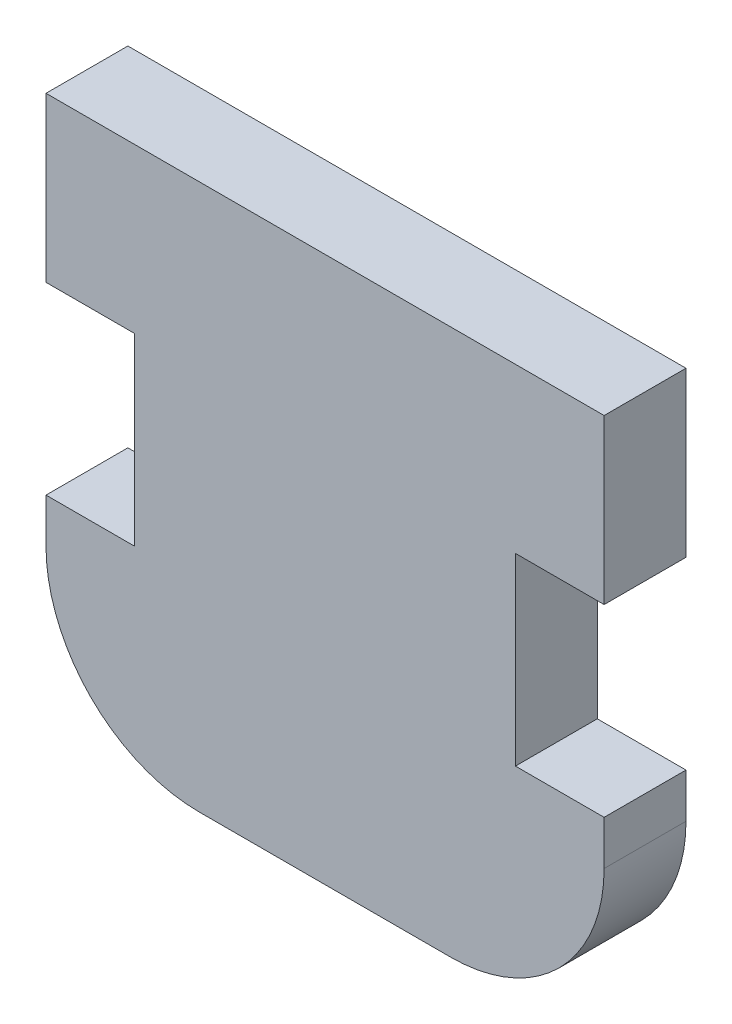
ISO-10303-21;
HEADER;
FILE_DESCRIPTION(('STEP AP214'),'2;1');
FILE_NAME('part.step','',(''),(''),'','','');
FILE_SCHEMA(('AUTOMOTIVE_DESIGN { 1 0 10303 214 1 1 1 1 }'));
ENDSEC;
DATA;
#1=APPLICATION_CONTEXT('core data for automotive mechanical design processes');
#2=APPLICATION_PROTOCOL_DEFINITION('international standard','automotive_design',2000,#1);
#3=PRODUCT_CONTEXT('',#1,'mechanical');
#4=PRODUCT('Part','Part','',(#3));
#5=PRODUCT_RELATED_PRODUCT_CATEGORY('part','',(#4));
#6=PRODUCT_DEFINITION_FORMATION('','',#4);
#7=PRODUCT_DEFINITION_CONTEXT('part definition',#1,'design');
#8=PRODUCT_DEFINITION('design','',#6,#7);
#9=PRODUCT_DEFINITION_SHAPE('','',#8);
#10=(LENGTH_UNIT() NAMED_UNIT(*) SI_UNIT(.MILLI.,.METRE.));
#11=(NAMED_UNIT(*) PLANE_ANGLE_UNIT() SI_UNIT($,.RADIAN.));
#12=(NAMED_UNIT(*) SI_UNIT($,.STERADIAN.) SOLID_ANGLE_UNIT());
#13=UNCERTAINTY_MEASURE_WITH_UNIT(LENGTH_MEASURE(1.E-05),#10,'distance_accuracy_value','');
#14=(GEOMETRIC_REPRESENTATION_CONTEXT(3) GLOBAL_UNCERTAINTY_ASSIGNED_CONTEXT((#13)) GLOBAL_UNIT_ASSIGNED_CONTEXT((#10,
#11,#12)) REPRESENTATION_CONTEXT('',''));
#15=CARTESIAN_POINT('',(0.,0.,0.));
#16=DIRECTION('',(0.,0.,1.));
#17=DIRECTION('',(1.,0.,0.));
#18=AXIS2_PLACEMENT_3D('',#15,#16,#17);
#19=CARTESIAN_POINT('',(-432.269899999999,-6.09600000000033,3.048));
#20=DIRECTION('',(0.,1.,0.));
#21=DIRECTION('',(-1.,0.,0.));
#22=AXIS2_PLACEMENT_3D('',#19,#20,#21);
#23=PLANE('',#22);
#24=DIRECTION('',(0.,0.,1.));
#25=VECTOR('',#24,1.);
#26=CARTESIAN_POINT('',(-435.825899999999,-6.09600000000033,3.048));
#27=LINE('',#26,#25);
#28=CARTESIAN_POINT('',(-435.825899999999,-6.09600000000033,0.));
#29=VERTEX_POINT('',#28);
#30=CARTESIAN_POINT('',(-435.825899999999,-6.09600000000033,3.048));
#31=VERTEX_POINT('',#30);
#32=EDGE_CURVE('E11',#29,#31,#27,.T.);
#33=ORIENTED_EDGE('',*,*,#32,.F.);
#34=DIRECTION('',(1.,0.,0.));
#35=VECTOR('',#34,1.);
#36=CARTESIAN_POINT('',(-438.238899999999,-6.09600000000033,0.));
#37=LINE('',#36,#35);
#38=CARTESIAN_POINT('',(-432.523899999999,-6.09600000000033,0.));
#39=VERTEX_POINT('',#38);
#40=EDGE_CURVE('E128',#39,#29,#37,.F.);
#41=ORIENTED_EDGE('',*,*,#40,.F.);
#42=DIRECTION('',(0.,0.,1.));
#43=VECTOR('',#42,1.);
#44=CARTESIAN_POINT('',(-432.523899999999,-6.09600000000033,3.048));
#45=LINE('',#44,#43);
#46=CARTESIAN_POINT('',(-432.523899999999,-6.09600000000033,3.048));
#47=VERTEX_POINT('',#46);
#48=EDGE_CURVE('E53',#39,#47,#45,.T.);
#49=ORIENTED_EDGE('',*,*,#48,.T.);
#50=DIRECTION('',(-1.,0.,0.));
#51=VECTOR('',#50,1.);
#52=CARTESIAN_POINT('',(-432.269899999999,-6.09600000000033,3.048));
#53=LINE('',#52,#51);
#54=EDGE_CURVE('E203',#47,#31,#53,.T.);
#55=ORIENTED_EDGE('',*,*,#54,.T.);
#56=EDGE_LOOP('',(#33,#41,#49,#55));
#57=FACE_BOUND('',#56,.T.);
#58=ADVANCED_FACE('F43',(#57),#23,.F.);
#59=CARTESIAN_POINT('',(-432.523899999999,-3.33066907387547E-13,3.048));
#60=DIRECTION('',(-1.,0.,0.));
#61=DIRECTION('',(0.,-1.,0.));
#62=AXIS2_PLACEMENT_3D('',#59,#60,#61);
#63=PLANE('',#62);
#64=ORIENTED_EDGE('',*,*,#48,.F.);
#65=DIRECTION('',(0.,1.,0.));
#66=VECTOR('',#65,1.);
#67=CARTESIAN_POINT('',(-432.523899999999,-14.6050000000003,0.));
#68=LINE('',#67,#66);
#69=CARTESIAN_POINT('',(-432.523899999999,-3.33066907387547E-13,0.));
#70=VERTEX_POINT('',#69);
#71=EDGE_CURVE('E166',#70,#39,#68,.F.);
#72=ORIENTED_EDGE('',*,*,#71,.F.);
#73=DIRECTION('',(0.,0.,1.));
#74=VECTOR('',#73,1.);
#75=CARTESIAN_POINT('',(-432.523899999999,-3.33066907387547E-13,3.048));
#76=LINE('',#75,#74);
#77=CARTESIAN_POINT('',(-432.523899999999,-3.33066907387547E-13,3.048));
#78=VERTEX_POINT('',#77);
#79=EDGE_CURVE('E196',#70,#78,#76,.T.);
#80=ORIENTED_EDGE('',*,*,#79,.T.);
#81=DIRECTION('',(0.,-1.,0.));
#82=VECTOR('',#81,1.);
#83=CARTESIAN_POINT('',(-432.523899999999,-3.33066907387547E-13,3.048));
#84=LINE('',#83,#82);
#85=EDGE_CURVE('E213',#78,#47,#84,.T.);
#86=ORIENTED_EDGE('',*,*,#85,.T.);
#87=EDGE_LOOP('',(#64,#72,#80,#86));
#88=FACE_BOUND('',#87,.T.);
#89=ADVANCED_FACE('F216',(#88),#63,.F.);
#90=CARTESIAN_POINT('',(-450.253099999998,-3.33066907387547E-13,3.048));
#91=DIRECTION('',(0.,-1.,0.));
#92=DIRECTION('',(1.,0.,0.));
#93=AXIS2_PLACEMENT_3D('',#90,#91,#92);
#94=PLANE('',#93);
#95=ORIENTED_EDGE('',*,*,#79,.F.);
#96=DIRECTION('',(1.,0.,0.));
#97=VECTOR('',#96,1.);
#98=CARTESIAN_POINT('',(-438.238899999999,-3.33066907387547E-13,0.));
#99=LINE('',#98,#97);
#100=CARTESIAN_POINT('',(-453.301099999998,-3.33066907387547E-13,0.));
#101=VERTEX_POINT('',#100);
#102=EDGE_CURVE('E163',#101,#70,#99,.T.);
#103=ORIENTED_EDGE('',*,*,#102,.F.);
#104=DIRECTION('',(0.,0.,1.));
#105=VECTOR('',#104,1.);
#106=CARTESIAN_POINT('',(-453.301099999998,-3.33066907387547E-13,3.048));
#107=LINE('',#106,#105);
#108=CARTESIAN_POINT('',(-453.301099999998,-3.33066907387547E-13,3.048));
#109=VERTEX_POINT('',#108);
#110=EDGE_CURVE('E193',#101,#109,#107,.T.);
#111=ORIENTED_EDGE('',*,*,#110,.T.);
#112=DIRECTION('',(1.,0.,0.));
#113=VECTOR('',#112,1.);
#114=CARTESIAN_POINT('',(-450.253099999998,-3.33066907387547E-13,3.048));
#115=LINE('',#114,#113);
#116=EDGE_CURVE('E217',#109,#78,#115,.T.);
#117=ORIENTED_EDGE('',*,*,#116,.T.);
#118=EDGE_LOOP('',(#95,#103,#111,#117));
#119=FACE_BOUND('',#118,.T.);
#120=ADVANCED_FACE('F280',(#119),#94,.F.);
#121=CARTESIAN_POINT('',(-453.301099999998,-14.6050000000003,3.048));
#122=DIRECTION('',(1.,0.,0.));
#123=DIRECTION('',(0.,1.,0.));
#124=AXIS2_PLACEMENT_3D('',#121,#122,#123);
#125=PLANE('',#124);
#126=ORIENTED_EDGE('',*,*,#110,.F.);
#127=DIRECTION('',(0.,1.,0.));
#128=VECTOR('',#127,1.);
#129=CARTESIAN_POINT('',(-453.301099999998,-14.6050000000003,0.));
#130=LINE('',#129,#128);
#131=CARTESIAN_POINT('',(-453.301099999998,-6.09600000000033,0.));
#132=VERTEX_POINT('',#131);
#133=EDGE_CURVE('E160',#132,#101,#130,.T.);
#134=ORIENTED_EDGE('',*,*,#133,.F.);
#135=DIRECTION('',(0.,0.,1.));
#136=VECTOR('',#135,1.);
#137=CARTESIAN_POINT('',(-453.301099999998,-6.09600000000033,3.048));
#138=LINE('',#137,#136);
#139=CARTESIAN_POINT('',(-453.301099999998,-6.09600000000033,3.048));
#140=VERTEX_POINT('',#139);
#141=EDGE_CURVE('E190',#132,#140,#138,.T.);
#142=ORIENTED_EDGE('',*,*,#141,.T.);
#143=DIRECTION('',(0.,1.,0.));
#144=VECTOR('',#143,1.);
#145=CARTESIAN_POINT('',(-453.301099999998,-14.6050000000003,3.048));
#146=LINE('',#145,#144);
#147=EDGE_CURVE('E219',#140,#109,#146,.T.);
#148=ORIENTED_EDGE('',*,*,#147,.T.);
#149=EDGE_LOOP('',(#126,#134,#142,#148));
#150=FACE_BOUND('',#149,.T.);
#151=ADVANCED_FACE('F299',(#150),#125,.F.);
#152=CARTESIAN_POINT('',(-453.555099999998,-6.09600000000033,3.048));
#153=DIRECTION('',(0.,1.,0.));
#154=DIRECTION('',(-1.,0.,0.));
#155=AXIS2_PLACEMENT_3D('',#152,#153,#154);
#156=PLANE('',#155);
#157=ORIENTED_EDGE('',*,*,#141,.F.);
#158=DIRECTION('',(1.,0.,0.));
#159=VECTOR('',#158,1.);
#160=CARTESIAN_POINT('',(-438.238899999999,-6.09600000000033,0.));
#161=LINE('',#160,#159);
#162=CARTESIAN_POINT('',(-449.999099999998,-6.09600000000033,0.));
#163=VERTEX_POINT('',#162);
#164=EDGE_CURVE('E157',#163,#132,#161,.F.);
#165=ORIENTED_EDGE('',*,*,#164,.F.);
#166=DIRECTION('',(0.,0.,1.));
#167=VECTOR('',#166,1.);
#168=CARTESIAN_POINT('',(-449.999099999998,-6.09600000000033,3.048));
#169=LINE('',#168,#167);
#170=CARTESIAN_POINT('',(-449.999099999998,-6.09600000000033,3.048));
#171=VERTEX_POINT('',#170);
#172=EDGE_CURVE('E187',#163,#171,#169,.T.);
#173=ORIENTED_EDGE('',*,*,#172,.T.);
#174=DIRECTION('',(-1.,0.,0.));
#175=VECTOR('',#174,1.);
#176=CARTESIAN_POINT('',(-453.555099999998,-6.09600000000033,3.048));
#177=LINE('',#176,#175);
#178=EDGE_CURVE('E240',#171,#140,#177,.T.);
#179=ORIENTED_EDGE('',*,*,#178,.T.);
#180=EDGE_LOOP('',(#157,#165,#173,#179));
#181=FACE_BOUND('',#180,.T.);
#182=ADVANCED_FACE('F284',(#181),#156,.F.);
#183=CARTESIAN_POINT('',(-449.999099999998,-12.9540000000003,3.048));
#184=DIRECTION('',(1.,0.,0.));
#185=DIRECTION('',(0.,1.,0.));
#186=AXIS2_PLACEMENT_3D('',#183,#184,#185);
#187=PLANE('',#186);
#188=ORIENTED_EDGE('',*,*,#172,.F.);
#189=DIRECTION('',(0.,1.,0.));
#190=VECTOR('',#189,1.);
#191=CARTESIAN_POINT('',(-449.999099999998,-14.6050000000003,0.));
#192=LINE('',#191,#190);
#193=CARTESIAN_POINT('',(-449.999099999998,-12.9540000000003,0.));
#194=VERTEX_POINT('',#193);
#195=EDGE_CURVE('E154',#194,#163,#192,.T.);
#196=ORIENTED_EDGE('',*,*,#195,.F.);
#197=DIRECTION('',(0.,0.,1.));
#198=VECTOR('',#197,1.);
#199=CARTESIAN_POINT('',(-449.999099999998,-12.9540000000003,3.048));
#200=LINE('',#199,#198);
#201=CARTESIAN_POINT('',(-449.999099999998,-12.9540000000003,3.048));
#202=VERTEX_POINT('',#201);
#203=EDGE_CURVE('E184',#194,#202,#200,.T.);
#204=ORIENTED_EDGE('',*,*,#203,.T.);
#205=DIRECTION('',(0.,1.,0.));
#206=VECTOR('',#205,1.);
#207=CARTESIAN_POINT('',(-449.999099999998,-12.9540000000003,3.048));
#208=LINE('',#207,#206);
#209=EDGE_CURVE('E237',#202,#171,#208,.T.);
#210=ORIENTED_EDGE('',*,*,#209,.T.);
#211=EDGE_LOOP('',(#188,#196,#204,#210));
#212=FACE_BOUND('',#211,.T.);
#213=ADVANCED_FACE('F288',(#212),#187,.F.);
#214=CARTESIAN_POINT('',(-453.555099999998,-12.9540000000003,3.048));
#215=DIRECTION('',(0.,-1.,0.));
#216=DIRECTION('',(1.,0.,0.));
#217=AXIS2_PLACEMENT_3D('',#214,#215,#216);
#218=PLANE('',#217);
#219=ORIENTED_EDGE('',*,*,#203,.F.);
#220=DIRECTION('',(1.,0.,0.));
#221=VECTOR('',#220,1.);
#222=CARTESIAN_POINT('',(-438.238899999999,-12.9540000000003,0.));
#223=LINE('',#222,#221);
#224=CARTESIAN_POINT('',(-453.301099999998,-12.9540000000003,0.));
#225=VERTEX_POINT('',#224);
#226=EDGE_CURVE('E151',#225,#194,#223,.T.);
#227=ORIENTED_EDGE('',*,*,#226,.F.);
#228=DIRECTION('',(0.,0.,1.));
#229=VECTOR('',#228,1.);
#230=CARTESIAN_POINT('',(-453.301099999998,-12.9540000000003,3.048));
#231=LINE('',#230,#229);
#232=CARTESIAN_POINT('',(-453.301099999998,-12.9540000000003,3.048));
#233=VERTEX_POINT('',#232);
#234=EDGE_CURVE('E181',#225,#233,#231,.T.);
#235=ORIENTED_EDGE('',*,*,#234,.T.);
#236=DIRECTION('',(1.,0.,0.));
#237=VECTOR('',#236,1.);
#238=CARTESIAN_POINT('',(-453.555099999998,-12.9540000000003,3.048));
#239=LINE('',#238,#237);
#240=EDGE_CURVE('E234',#233,#202,#239,.T.);
#241=ORIENTED_EDGE('',*,*,#240,.T.);
#242=EDGE_LOOP('',(#219,#227,#235,#241));
#243=FACE_BOUND('',#242,.T.);
#244=ADVANCED_FACE('F291',(#243),#218,.F.);
#245=ORIENTED_EDGE('',*,*,#234,.F.);
#246=DIRECTION('',(0.,1.,0.));
#247=VECTOR('',#246,1.);
#248=CARTESIAN_POINT('',(-453.301099999998,-14.6050000000003,0.));
#249=LINE('',#248,#247);
#250=CARTESIAN_POINT('',(-453.301099999998,-14.6050000000003,0.));
#251=VERTEX_POINT('',#250);
#252=EDGE_CURVE('E148',#251,#225,#249,.T.);
#253=ORIENTED_EDGE('',*,*,#252,.F.);
#254=DIRECTION('',(0.,0.,1.));
#255=VECTOR('',#254,1.);
#256=CARTESIAN_POINT('',(-453.301099999998,-14.6050000000003,3.048));
#257=LINE('',#256,#255);
#258=CARTESIAN_POINT('',(-453.301099999998,-14.6050000000003,3.048));
#259=VERTEX_POINT('',#258);
#260=EDGE_CURVE('E178',#251,#259,#257,.T.);
#261=ORIENTED_EDGE('',*,*,#260,.T.);
#262=EDGE_CURVE('E231',#259,#233,#146,.T.);
#263=ORIENTED_EDGE('',*,*,#262,.T.);
#264=EDGE_LOOP('',(#245,#253,#261,#263));
#265=FACE_BOUND('',#264,.T.);
#266=ADVANCED_FACE('F251',(#265),#125,.F.);
#267=CARTESIAN_POINT('',(-447.586099999998,-14.6050000000003,3.048));
#268=DIRECTION('',(0.,0.,1.));
#269=DIRECTION('',(1.,0.,0.));
#270=AXIS2_PLACEMENT_3D('',#267,#268,#269);
#271=CYLINDRICAL_SURFACE('',#270,5.71500000000003);
#272=ORIENTED_EDGE('',*,*,#260,.F.);
#273=CARTESIAN_POINT('',(-447.586099999998,-14.6050000000003,0.));
#274=DIRECTION('',(0.,0.,1.));
#275=DIRECTION('',(1.,0.,0.));
#276=AXIS2_PLACEMENT_3D('',#273,#274,#275);
#277=CIRCLE('',#276,5.71500000000003);
#278=CARTESIAN_POINT('',(-447.586099999998,-20.3200000000003,0.));
#279=VERTEX_POINT('',#278);
#280=EDGE_CURVE('E145',#251,#279,#277,.T.);
#281=ORIENTED_EDGE('',*,*,#280,.T.);
#282=DIRECTION('',(0.,0.,1.));
#283=VECTOR('',#282,1.);
#284=CARTESIAN_POINT('',(-447.586099999998,-20.3200000000003,3.048));
#285=LINE('',#284,#283);
#286=CARTESIAN_POINT('',(-447.586099999998,-20.3200000000003,3.048));
#287=VERTEX_POINT('',#286);
#288=EDGE_CURVE('E175',#279,#287,#285,.T.);
#289=ORIENTED_EDGE('',*,*,#288,.T.);
#290=CARTESIAN_POINT('',(-447.586099999998,-14.6050000000003,3.048));
#291=DIRECTION('',(0.,0.,1.));
#292=DIRECTION('',(1.,0.,0.));
#293=AXIS2_PLACEMENT_3D('',#290,#291,#292);
#294=CIRCLE('',#293,5.71500000000003);
#295=EDGE_CURVE('E227',#259,#287,#294,.T.);
#296=ORIENTED_EDGE('',*,*,#295,.F.);
#297=EDGE_LOOP('',(#272,#281,#289,#296));
#298=FACE_BOUND('',#297,.T.);
#299=ADVANCED_FACE('F261',(#298),#271,.T.);
#300=CARTESIAN_POINT('',(-438.238899999999,-20.3200000000003,3.048));
#301=DIRECTION('',(0.,1.,0.));
#302=DIRECTION('',(-1.,0.,0.));
#303=AXIS2_PLACEMENT_3D('',#300,#301,#302);
#304=PLANE('',#303);
#305=ORIENTED_EDGE('',*,*,#288,.F.);
#306=DIRECTION('',(1.,0.,0.));
#307=VECTOR('',#306,1.);
#308=CARTESIAN_POINT('',(-438.238899999999,-20.3200000000003,0.));
#309=LINE('',#308,#307);
#310=CARTESIAN_POINT('',(-438.238899999999,-20.3200000000003,0.));
#311=VERTEX_POINT('',#310);
#312=EDGE_CURVE('E142',#311,#279,#309,.F.);
#313=ORIENTED_EDGE('',*,*,#312,.F.);
#314=DIRECTION('',(0.,0.,1.));
#315=VECTOR('',#314,1.);
#316=CARTESIAN_POINT('',(-438.238899999999,-20.3200000000003,3.048));
#317=LINE('',#316,#315);
#318=CARTESIAN_POINT('',(-438.238899999999,-20.3200000000003,3.048));
#319=VERTEX_POINT('',#318);
#320=EDGE_CURVE('E172',#311,#319,#317,.T.);
#321=ORIENTED_EDGE('',*,*,#320,.T.);
#322=DIRECTION('',(-1.,0.,0.));
#323=VECTOR('',#322,1.);
#324=CARTESIAN_POINT('',(-438.238899999999,-20.3200000000003,3.048));
#325=LINE('',#324,#323);
#326=EDGE_CURVE('E223',#319,#287,#325,.T.);
#327=ORIENTED_EDGE('',*,*,#326,.T.);
#328=EDGE_LOOP('',(#305,#313,#321,#327));
#329=FACE_BOUND('',#328,.T.);
#330=ADVANCED_FACE('F265',(#329),#304,.F.);
#331=CARTESIAN_POINT('',(-438.238899999999,-14.6050000000003,3.048));
#332=DIRECTION('',(0.,0.,1.));
#333=DIRECTION('',(1.,0.,0.));
#334=AXIS2_PLACEMENT_3D('',#331,#332,#333);
#335=CYLINDRICAL_SURFACE('',#334,5.71500000000003);
#336=ORIENTED_EDGE('',*,*,#320,.F.);
#337=CARTESIAN_POINT('',(-438.238899999999,-14.6050000000003,0.));
#338=DIRECTION('',(0.,0.,1.));
#339=DIRECTION('',(1.,0.,0.));
#340=AXIS2_PLACEMENT_3D('',#337,#338,#339);
#341=CIRCLE('',#340,5.71500000000003);
#342=CARTESIAN_POINT('',(-432.523899999999,-14.6050000000003,0.));
#343=VERTEX_POINT('',#342);
#344=EDGE_CURVE('E139',#311,#343,#341,.T.);
#345=ORIENTED_EDGE('',*,*,#344,.T.);
#346=DIRECTION('',(0.,0.,1.));
#347=VECTOR('',#346,1.);
#348=CARTESIAN_POINT('',(-432.523899999999,-14.6050000000003,3.048));
#349=LINE('',#348,#347);
#350=CARTESIAN_POINT('',(-432.523899999999,-14.6050000000003,3.048));
#351=VERTEX_POINT('',#350);
#352=EDGE_CURVE('E170',#343,#351,#349,.T.);
#353=ORIENTED_EDGE('',*,*,#352,.T.);
#354=CARTESIAN_POINT('',(-438.238899999999,-14.6050000000003,3.048));
#355=DIRECTION('',(0.,0.,1.));
#356=DIRECTION('',(1.,0.,0.));
#357=AXIS2_PLACEMENT_3D('',#354,#355,#356);
#358=CIRCLE('',#357,5.71500000000003);
#359=EDGE_CURVE('E134',#319,#351,#358,.T.);
#360=ORIENTED_EDGE('',*,*,#359,.F.);
#361=EDGE_LOOP('',(#336,#345,#353,#360));
#362=FACE_BOUND('',#361,.T.);
#363=ADVANCED_FACE('F268',(#362),#335,.T.);
#364=ORIENTED_EDGE('',*,*,#352,.F.);
#365=DIRECTION('',(0.,1.,0.));
#366=VECTOR('',#365,1.);
#367=CARTESIAN_POINT('',(-432.523899999999,-14.6050000000003,0.));
#368=LINE('',#367,#366);
#369=CARTESIAN_POINT('',(-432.523899999999,-12.9540000000003,0.));
#370=VERTEX_POINT('',#369);
#371=EDGE_CURVE('E136',#370,#343,#368,.F.);
#372=ORIENTED_EDGE('',*,*,#371,.F.);
#373=DIRECTION('',(0.,0.,1.));
#374=VECTOR('',#373,1.);
#375=CARTESIAN_POINT('',(-432.523899999999,-12.9540000000003,3.048));
#376=LINE('',#375,#374);
#377=CARTESIAN_POINT('',(-432.523899999999,-12.9540000000003,3.048));
#378=VERTEX_POINT('',#377);
#379=EDGE_CURVE('E61',#370,#378,#376,.T.);
#380=ORIENTED_EDGE('',*,*,#379,.T.);
#381=EDGE_CURVE('E121',#378,#351,#84,.T.);
#382=ORIENTED_EDGE('',*,*,#381,.T.);
#383=EDGE_LOOP('',(#364,#372,#380,#382));
#384=FACE_BOUND('',#383,.T.);
#385=ADVANCED_FACE('F307',(#384),#63,.F.);
#386=CARTESIAN_POINT('',(-432.269899999999,-12.9540000000003,3.048));
#387=DIRECTION('',(0.,-1.,0.));
#388=DIRECTION('',(1.,0.,0.));
#389=AXIS2_PLACEMENT_3D('',#386,#387,#388);
#390=PLANE('',#389);
#391=ORIENTED_EDGE('',*,*,#379,.F.);
#392=DIRECTION('',(1.,0.,0.));
#393=VECTOR('',#392,1.);
#394=CARTESIAN_POINT('',(-438.238899999999,-12.9540000000003,0.));
#395=LINE('',#394,#393);
#396=CARTESIAN_POINT('',(-435.825899999999,-12.9540000000003,0.));
#397=VERTEX_POINT('',#396);
#398=EDGE_CURVE('E126',#397,#370,#395,.T.);
#399=ORIENTED_EDGE('',*,*,#398,.F.);
#400=DIRECTION('',(0.,0.,1.));
#401=VECTOR('',#400,1.);
#402=CARTESIAN_POINT('',(-435.825899999999,-12.9540000000003,3.048));
#403=LINE('',#402,#401);
#404=CARTESIAN_POINT('',(-435.825899999999,-12.9540000000003,3.048));
#405=VERTEX_POINT('',#404);
#406=EDGE_CURVE('E47',#397,#405,#403,.T.);
#407=ORIENTED_EDGE('',*,*,#406,.T.);
#408=DIRECTION('',(1.,0.,0.));
#409=VECTOR('',#408,1.);
#410=CARTESIAN_POINT('',(-432.269899999999,-12.9540000000003,3.048));
#411=LINE('',#410,#409);
#412=EDGE_CURVE('E138',#405,#378,#411,.T.);
#413=ORIENTED_EDGE('',*,*,#412,.T.);
#414=EDGE_LOOP('',(#391,#399,#407,#413));
#415=FACE_BOUND('',#414,.T.);
#416=ADVANCED_FACE('F130',(#415),#390,.F.);
#417=CARTESIAN_POINT('',(-435.825899999999,-12.9540000000003,3.048));
#418=DIRECTION('',(-1.,0.,0.));
#419=DIRECTION('',(0.,-1.,0.));
#420=AXIS2_PLACEMENT_3D('',#417,#418,#419);
#421=PLANE('',#420);
#422=DIRECTION('',(0.,1.,0.));
#423=VECTOR('',#422,1.);
#424=CARTESIAN_POINT('',(-435.825899999999,-14.6050000000003,0.));
#425=LINE('',#424,#423);
#426=EDGE_CURVE('E115',#29,#397,#425,.F.);
#427=ORIENTED_EDGE('',*,*,#426,.F.);
#428=ORIENTED_EDGE('',*,*,#32,.T.);
#429=DIRECTION('',(0.,-1.,0.));
#430=VECTOR('',#429,1.);
#431=CARTESIAN_POINT('',(-435.825899999999,-12.9540000000003,3.048));
#432=LINE('',#431,#430);
#433=EDGE_CURVE('E117',#31,#405,#432,.T.);
#434=ORIENTED_EDGE('',*,*,#433,.T.);
#435=ORIENTED_EDGE('',*,*,#406,.F.);
#436=EDGE_LOOP('',(#427,#428,#434,#435));
#437=FACE_BOUND('',#436,.T.);
#438=ADVANCED_FACE('F45',(#437),#421,.F.);
#439=CARTESIAN_POINT('',(-438.238899999999,-14.6050000000003,3.048));
#440=DIRECTION('',(0.,0.,1.));
#441=DIRECTION('',(1.,0.,0.));
#442=AXIS2_PLACEMENT_3D('',#439,#440,#441);
#443=PLANE('',#442);
#444=ORIENTED_EDGE('',*,*,#412,.F.);
#445=ORIENTED_EDGE('',*,*,#433,.F.);
#446=ORIENTED_EDGE('',*,*,#54,.F.);
#447=ORIENTED_EDGE('',*,*,#85,.F.);
#448=ORIENTED_EDGE('',*,*,#116,.F.);
#449=ORIENTED_EDGE('',*,*,#147,.F.);
#450=ORIENTED_EDGE('',*,*,#178,.F.);
#451=ORIENTED_EDGE('',*,*,#209,.F.);
#452=ORIENTED_EDGE('',*,*,#240,.F.);
#453=ORIENTED_EDGE('',*,*,#262,.F.);
#454=ORIENTED_EDGE('',*,*,#295,.T.);
#455=ORIENTED_EDGE('',*,*,#326,.F.);
#456=ORIENTED_EDGE('',*,*,#359,.T.);
#457=ORIENTED_EDGE('',*,*,#381,.F.);
#458=EDGE_LOOP('',(#444,#445,#446,#447,#448,#449,#450,#451,#452,#453,#454,#455,#456,#457));
#459=FACE_BOUND('',#458,.T.);
#460=ADVANCED_FACE('F211',(#459),#443,.T.);
#461=CARTESIAN_POINT('',(-438.238899999999,-14.6050000000003,0.));
#462=DIRECTION('',(0.,0.,1.));
#463=DIRECTION('',(1.,0.,0.));
#464=AXIS2_PLACEMENT_3D('',#461,#462,#463);
#465=PLANE('',#464);
#466=ORIENTED_EDGE('',*,*,#398,.T.);
#467=ORIENTED_EDGE('',*,*,#371,.T.);
#468=ORIENTED_EDGE('',*,*,#344,.F.);
#469=ORIENTED_EDGE('',*,*,#312,.T.);
#470=ORIENTED_EDGE('',*,*,#280,.F.);
#471=ORIENTED_EDGE('',*,*,#252,.T.);
#472=ORIENTED_EDGE('',*,*,#226,.T.);
#473=ORIENTED_EDGE('',*,*,#195,.T.);
#474=ORIENTED_EDGE('',*,*,#164,.T.);
#475=ORIENTED_EDGE('',*,*,#133,.T.);
#476=ORIENTED_EDGE('',*,*,#102,.T.);
#477=ORIENTED_EDGE('',*,*,#71,.T.);
#478=ORIENTED_EDGE('',*,*,#40,.T.);
#479=ORIENTED_EDGE('',*,*,#426,.T.);
#480=EDGE_LOOP('',(#466,#467,#468,#469,#470,#471,#472,#473,#474,#475,#476,#477,#478,#479));
#481=FACE_BOUND('',#480,.T.);
#482=ADVANCED_FACE('F124',(#481),#465,.F.);
#483=CLOSED_SHELL('',(#58,#89,#120,#151,#182,#213,#244,#266,#299,#330,#363,#385,#416,#438,#460,#482));
#484=MANIFOLD_SOLID_BREP('B2',#483);
#485=ADVANCED_BREP_SHAPE_REPRESENTATION('',(#18,#484),#14);
#486=SHAPE_DEFINITION_REPRESENTATION(#9,#485);
ENDSEC;
END-ISO-10303-21;
